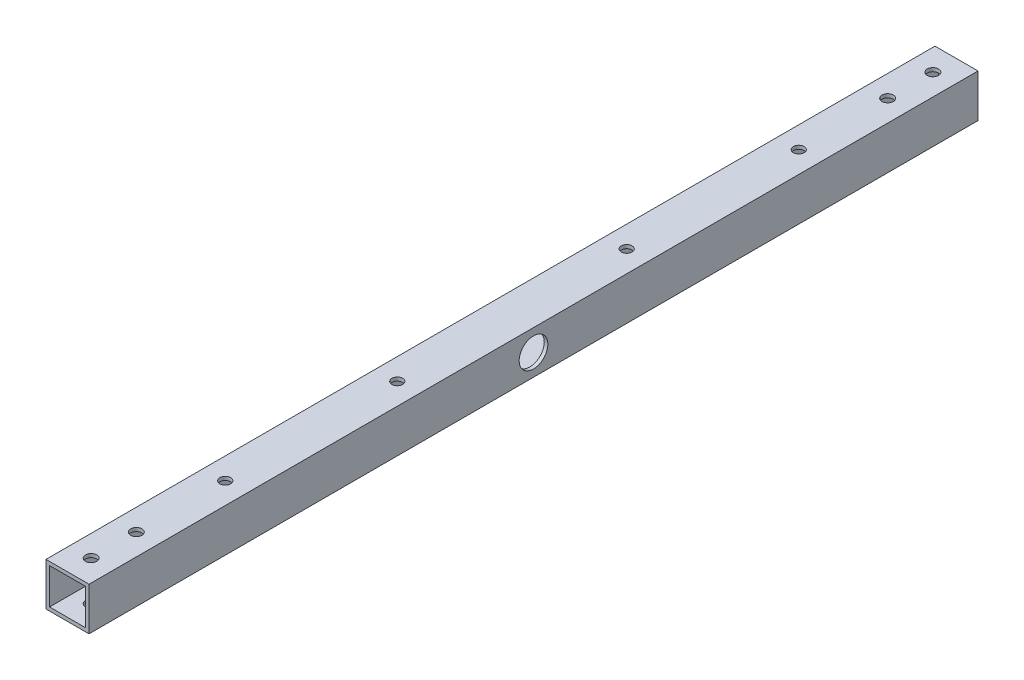
ISO-10303-21;
HEADER;
FILE_DESCRIPTION(('STEP AP214'),'2;1');
FILE_NAME('part.step','',(''),(''),'','','');
FILE_SCHEMA(('AUTOMOTIVE_DESIGN { 1 0 10303 214 1 1 1 1 }'));
ENDSEC;
DATA;
#1=APPLICATION_CONTEXT('core data for automotive mechanical design processes');
#2=APPLICATION_PROTOCOL_DEFINITION('international standard','automotive_design',2000,#1);
#3=PRODUCT_CONTEXT('',#1,'mechanical');
#4=PRODUCT('Part','Part','',(#3));
#5=PRODUCT_RELATED_PRODUCT_CATEGORY('part','',(#4));
#6=PRODUCT_DEFINITION_FORMATION('','',#4);
#7=PRODUCT_DEFINITION_CONTEXT('part definition',#1,'design');
#8=PRODUCT_DEFINITION('design','',#6,#7);
#9=PRODUCT_DEFINITION_SHAPE('','',#8);
#10=(LENGTH_UNIT() NAMED_UNIT(*) SI_UNIT(.MILLI.,.METRE.));
#11=(NAMED_UNIT(*) PLANE_ANGLE_UNIT() SI_UNIT($,.RADIAN.));
#12=(NAMED_UNIT(*) SI_UNIT($,.STERADIAN.) SOLID_ANGLE_UNIT());
#13=UNCERTAINTY_MEASURE_WITH_UNIT(LENGTH_MEASURE(1.E-05),#10,'distance_accuracy_value','');
#14=(GEOMETRIC_REPRESENTATION_CONTEXT(3) GLOBAL_UNCERTAINTY_ASSIGNED_CONTEXT((#13)) GLOBAL_UNIT_ASSIGNED_CONTEXT((#10,
#11,#12)) REPRESENTATION_CONTEXT('',''));
#15=CARTESIAN_POINT('',(0.,0.,0.));
#16=DIRECTION('',(0.,0.,1.));
#17=DIRECTION('',(1.,0.,0.));
#18=AXIS2_PLACEMENT_3D('',#15,#16,#17);
#19=CARTESIAN_POINT('',(0.,0.,196.85));
#20=DIRECTION('',(0.,0.,-1.));
#21=DIRECTION('',(-1.,0.,0.));
#22=AXIS2_PLACEMENT_3D('',#19,#20,#21);
#23=PLANE('',#22);
#24=DIRECTION('',(0.,1.,0.));
#25=VECTOR('',#24,1.);
#26=CARTESIAN_POINT('',(9.525,-9.525,196.85));
#27=LINE('',#26,#25);
#28=CARTESIAN_POINT('',(9.525,-9.525,196.85));
#29=VERTEX_POINT('',#28);
#30=CARTESIAN_POINT('',(9.525,9.525,196.85));
#31=VERTEX_POINT('',#30);
#32=EDGE_CURVE('E137',#29,#31,#27,.T.);
#33=ORIENTED_EDGE('',*,*,#32,.T.);
#34=DIRECTION('',(-1.,0.,0.));
#35=VECTOR('',#34,1.);
#36=CARTESIAN_POINT('',(-9.525,9.525,196.85));
#37=LINE('',#36,#35);
#38=CARTESIAN_POINT('',(-9.525,9.525,196.85));
#39=VERTEX_POINT('',#38);
#40=EDGE_CURVE('E140',#31,#39,#37,.T.);
#41=ORIENTED_EDGE('',*,*,#40,.T.);
#42=DIRECTION('',(0.,-1.,0.));
#43=VECTOR('',#42,1.);
#44=CARTESIAN_POINT('',(-9.525,-9.525,196.85));
#45=LINE('',#44,#43);
#46=CARTESIAN_POINT('',(-9.525,-9.525,196.85));
#47=VERTEX_POINT('',#46);
#48=EDGE_CURVE('E143',#39,#47,#45,.T.);
#49=ORIENTED_EDGE('',*,*,#48,.T.);
#50=DIRECTION('',(1.,0.,0.));
#51=VECTOR('',#50,1.);
#52=CARTESIAN_POINT('',(-9.525,-9.525,196.85));
#53=LINE('',#52,#51);
#54=EDGE_CURVE('E145',#47,#29,#53,.T.);
#55=ORIENTED_EDGE('',*,*,#54,.T.);
#56=EDGE_LOOP('',(#33,#41,#49,#55));
#57=FACE_BOUND('',#56,.T.);
#58=DIRECTION('',(0.,1.,0.));
#59=VECTOR('',#58,1.);
#60=CARTESIAN_POINT('',(7.9375,-7.9375,196.85));
#61=LINE('',#60,#59);
#62=CARTESIAN_POINT('',(7.9375,-7.9375,196.85));
#63=VERTEX_POINT('',#62);
#64=CARTESIAN_POINT('',(7.9375,7.9375,196.85));
#65=VERTEX_POINT('',#64);
#66=EDGE_CURVE('E99',#63,#65,#61,.T.);
#67=ORIENTED_EDGE('',*,*,#66,.F.);
#68=DIRECTION('',(1.,0.,0.));
#69=VECTOR('',#68,1.);
#70=CARTESIAN_POINT('',(-7.9375,-7.9375,196.85));
#71=LINE('',#70,#69);
#72=CARTESIAN_POINT('',(-7.9375,-7.9375,196.85));
#73=VERTEX_POINT('',#72);
#74=EDGE_CURVE('E121',#73,#63,#71,.T.);
#75=ORIENTED_EDGE('',*,*,#74,.F.);
#76=DIRECTION('',(0.,-1.,0.));
#77=VECTOR('',#76,1.);
#78=CARTESIAN_POINT('',(-7.9375,-7.9375,196.85));
#79=LINE('',#78,#77);
#80=CARTESIAN_POINT('',(-7.9375,7.9375,196.85));
#81=VERTEX_POINT('',#80);
#82=EDGE_CURVE('E119',#81,#73,#79,.T.);
#83=ORIENTED_EDGE('',*,*,#82,.F.);
#84=DIRECTION('',(-1.,0.,0.));
#85=VECTOR('',#84,1.);
#86=CARTESIAN_POINT('',(-7.9375,7.9375,196.85));
#87=LINE('',#86,#85);
#88=EDGE_CURVE('E107',#65,#81,#87,.T.);
#89=ORIENTED_EDGE('',*,*,#88,.F.);
#90=EDGE_LOOP('',(#67,#75,#83,#89));
#91=FACE_BOUND('',#90,.T.);
#92=ADVANCED_FACE('F32',(#57,#91),#23,.F.);
#93=CARTESIAN_POINT('',(0.,0.,-196.85));
#94=DIRECTION('',(0.,0.,-1.));
#95=DIRECTION('',(-1.,0.,0.));
#96=AXIS2_PLACEMENT_3D('',#93,#94,#95);
#97=PLANE('',#96);
#98=DIRECTION('',(0.,1.,0.));
#99=VECTOR('',#98,1.);
#100=CARTESIAN_POINT('',(9.525,-9.525,-196.85));
#101=LINE('',#100,#99);
#102=CARTESIAN_POINT('',(9.525,-9.525,-196.85));
#103=VERTEX_POINT('',#102);
#104=CARTESIAN_POINT('',(9.525,9.525,-196.85));
#105=VERTEX_POINT('',#104);
#106=EDGE_CURVE('E115',#103,#105,#101,.T.);
#107=ORIENTED_EDGE('',*,*,#106,.F.);
#108=DIRECTION('',(1.,0.,0.));
#109=VECTOR('',#108,1.);
#110=CARTESIAN_POINT('',(-9.525,-9.525,-196.85));
#111=LINE('',#110,#109);
#112=CARTESIAN_POINT('',(-9.525,-9.525,-196.85));
#113=VERTEX_POINT('',#112);
#114=EDGE_CURVE('E141',#113,#103,#111,.T.);
#115=ORIENTED_EDGE('',*,*,#114,.F.);
#116=DIRECTION('',(0.,-1.,0.));
#117=VECTOR('',#116,1.);
#118=CARTESIAN_POINT('',(-9.525,-9.525,-196.85));
#119=LINE('',#118,#117);
#120=CARTESIAN_POINT('',(-9.525,9.525,-196.85));
#121=VERTEX_POINT('',#120);
#122=EDGE_CURVE('E152',#121,#113,#119,.T.);
#123=ORIENTED_EDGE('',*,*,#122,.F.);
#124=DIRECTION('',(-1.,0.,0.));
#125=VECTOR('',#124,1.);
#126=CARTESIAN_POINT('',(-9.525,9.525,-196.85));
#127=LINE('',#126,#125);
#128=EDGE_CURVE('E150',#105,#121,#127,.T.);
#129=ORIENTED_EDGE('',*,*,#128,.F.);
#130=EDGE_LOOP('',(#107,#115,#123,#129));
#131=FACE_BOUND('',#130,.T.);
#132=DIRECTION('',(1.,0.,0.));
#133=VECTOR('',#132,1.);
#134=CARTESIAN_POINT('',(-7.9375,-7.9375,-196.85));
#135=LINE('',#134,#133);
#136=CARTESIAN_POINT('',(-7.9375,-7.9375,-196.85));
#137=VERTEX_POINT('',#136);
#138=CARTESIAN_POINT('',(7.9375,-7.9375,-196.85));
#139=VERTEX_POINT('',#138);
#140=EDGE_CURVE('E108',#137,#139,#135,.T.);
#141=ORIENTED_EDGE('',*,*,#140,.T.);
#142=DIRECTION('',(0.,1.,0.));
#143=VECTOR('',#142,1.);
#144=CARTESIAN_POINT('',(7.9375,-7.9375,-196.85));
#145=LINE('',#144,#143);
#146=CARTESIAN_POINT('',(7.9375,7.9375,-196.85));
#147=VERTEX_POINT('',#146);
#148=EDGE_CURVE('E57',#139,#147,#145,.T.);
#149=ORIENTED_EDGE('',*,*,#148,.T.);
#150=DIRECTION('',(-1.,0.,0.));
#151=VECTOR('',#150,1.);
#152=CARTESIAN_POINT('',(-7.9375,7.9375,-196.85));
#153=LINE('',#152,#151);
#154=CARTESIAN_POINT('',(-7.9375,7.9375,-196.85));
#155=VERTEX_POINT('',#154);
#156=EDGE_CURVE('E114',#147,#155,#153,.T.);
#157=ORIENTED_EDGE('',*,*,#156,.T.);
#158=DIRECTION('',(0.,-1.,0.));
#159=VECTOR('',#158,1.);
#160=CARTESIAN_POINT('',(-7.9375,-7.9375,-196.85));
#161=LINE('',#160,#159);
#162=EDGE_CURVE('E129',#155,#137,#161,.T.);
#163=ORIENTED_EDGE('',*,*,#162,.T.);
#164=EDGE_LOOP('',(#141,#149,#157,#163));
#165=FACE_BOUND('',#164,.T.);
#166=ADVANCED_FACE('F281',(#131,#165),#97,.T.);
#167=CARTESIAN_POINT('',(9.525,-9.525,196.85));
#168=DIRECTION('',(-1.,0.,0.));
#169=DIRECTION('',(0.,0.,1.));
#170=AXIS2_PLACEMENT_3D('',#167,#168,#169);
#171=PLANE('',#170);
#172=CARTESIAN_POINT('',(9.525,0.,0.));
#173=DIRECTION('',(1.,0.,0.));
#174=DIRECTION('',(0.,0.,-1.));
#175=AXIS2_PLACEMENT_3D('',#172,#173,#174);
#176=CIRCLE('',#175,6.35);
#177=CARTESIAN_POINT('',(9.525,0.,-6.35));
#178=VERTEX_POINT('',#177);
#179=EDGE_CURVE('E254',#178,#178,#176,.T.);
#180=ORIENTED_EDGE('',*,*,#179,.F.);
#181=EDGE_LOOP('',(#180));
#182=FACE_BOUND('',#181,.T.);
#183=ORIENTED_EDGE('',*,*,#106,.T.);
#184=DIRECTION('',(0.,0.,-1.));
#185=VECTOR('',#184,1.);
#186=CARTESIAN_POINT('',(9.525,9.525,196.85));
#187=LINE('',#186,#185);
#188=EDGE_CURVE('E11',#31,#105,#187,.T.);
#189=ORIENTED_EDGE('',*,*,#188,.F.);
#190=ORIENTED_EDGE('',*,*,#32,.F.);
#191=DIRECTION('',(0.,0.,-1.));
#192=VECTOR('',#191,1.);
#193=CARTESIAN_POINT('',(9.525,-9.525,196.85));
#194=LINE('',#193,#192);
#195=EDGE_CURVE('E147',#29,#103,#194,.T.);
#196=ORIENTED_EDGE('',*,*,#195,.T.);
#197=EDGE_LOOP('',(#183,#189,#190,#196));
#198=FACE_BOUND('',#197,.T.);
#199=ADVANCED_FACE('F34',(#182,#198),#171,.F.);
#200=CARTESIAN_POINT('',(-9.525,9.525,196.85));
#201=DIRECTION('',(0.,-1.,0.));
#202=DIRECTION('',(0.,0.,-1.));
#203=AXIS2_PLACEMENT_3D('',#200,#201,#202);
#204=PLANE('',#203);
#205=CARTESIAN_POINT('',(-1.94289029309402E-13,9.525,-50.8));
#206=DIRECTION('',(0.,-1.,0.));
#207=DIRECTION('',(0.,0.,-1.));
#208=AXIS2_PLACEMENT_3D('',#205,#206,#207);
#209=CIRCLE('',#208,2.38125);
#210=CARTESIAN_POINT('',(-1.94289029309402E-13,9.525,-53.18125));
#211=VERTEX_POINT('',#210);
#212=EDGE_CURVE('E180',#211,#211,#209,.T.);
#213=ORIENTED_EDGE('',*,*,#212,.T.);
#214=EDGE_LOOP('',(#213));
#215=FACE_BOUND('',#214,.T.);
#216=CARTESIAN_POINT('',(-1.94289029309402E-13,9.525,50.8));
#217=DIRECTION('',(0.,-1.,0.));
#218=DIRECTION('',(0.,0.,-1.));
#219=AXIS2_PLACEMENT_3D('',#216,#217,#218);
#220=CIRCLE('',#219,2.38124999999998);
#221=CARTESIAN_POINT('',(-1.94289029309402E-13,9.525,48.41875));
#222=VERTEX_POINT('',#221);
#223=EDGE_CURVE('E214',#222,#222,#220,.T.);
#224=ORIENTED_EDGE('',*,*,#223,.T.);
#225=EDGE_LOOP('',(#224));
#226=FACE_BOUND('',#225,.T.);
#227=CARTESIAN_POINT('',(-4.71844785465692E-13,9.525,-127.));
#228=DIRECTION('',(0.,-1.,0.));
#229=DIRECTION('',(0.,0.,-1.));
#230=AXIS2_PLACEMENT_3D('',#227,#228,#229);
#231=CIRCLE('',#230,2.38125);
#232=CARTESIAN_POINT('',(-4.71844785465692E-13,9.525,-129.38125));
#233=VERTEX_POINT('',#232);
#234=EDGE_CURVE('E197',#233,#233,#231,.T.);
#235=ORIENTED_EDGE('',*,*,#234,.T.);
#236=EDGE_LOOP('',(#235));
#237=FACE_BOUND('',#236,.T.);
#238=CARTESIAN_POINT('',(-4.71844785465692E-13,9.525,127.));
#239=DIRECTION('',(0.,-1.,0.));
#240=DIRECTION('',(0.,0.,-1.));
#241=AXIS2_PLACEMENT_3D('',#238,#239,#240);
#242=CIRCLE('',#241,2.38125);
#243=CARTESIAN_POINT('',(-4.71844785465692E-13,9.525,124.61875));
#244=VERTEX_POINT('',#243);
#245=EDGE_CURVE('E193',#244,#244,#242,.T.);
#246=ORIENTED_EDGE('',*,*,#245,.T.);
#247=EDGE_LOOP('',(#246));
#248=FACE_BOUND('',#247,.T.);
#249=CARTESIAN_POINT('',(0.,9.525,-166.375));
#250=DIRECTION('',(0.,-1.,0.));
#251=DIRECTION('',(0.,0.,-1.));
#252=AXIS2_PLACEMENT_3D('',#249,#250,#251);
#253=CIRCLE('',#252,2.5);
#254=CARTESIAN_POINT('',(0.,9.525,-168.875));
#255=VERTEX_POINT('',#254);
#256=EDGE_CURVE('E170',#255,#255,#253,.F.);
#257=ORIENTED_EDGE('',*,*,#256,.F.);
#258=EDGE_LOOP('',(#257));
#259=FACE_BOUND('',#258,.T.);
#260=CARTESIAN_POINT('',(0.,9.525,-186.375));
#261=DIRECTION('',(0.,-1.,0.));
#262=DIRECTION('',(0.,0.,-1.));
#263=AXIS2_PLACEMENT_3D('',#260,#261,#262);
#264=CIRCLE('',#263,2.5);
#265=CARTESIAN_POINT('',(0.,9.525,-188.875));
#266=VERTEX_POINT('',#265);
#267=EDGE_CURVE('E185',#266,#266,#264,.F.);
#268=ORIENTED_EDGE('',*,*,#267,.F.);
#269=EDGE_LOOP('',(#268));
#270=FACE_BOUND('',#269,.T.);
#271=CARTESIAN_POINT('',(0.,9.525,166.375));
#272=DIRECTION('',(0.,-1.,0.));
#273=DIRECTION('',(0.,0.,-1.));
#274=AXIS2_PLACEMENT_3D('',#271,#272,#273);
#275=CIRCLE('',#274,2.5);
#276=CARTESIAN_POINT('',(0.,9.525,163.875));
#277=VERTEX_POINT('',#276);
#278=EDGE_CURVE('E251',#277,#277,#275,.T.);
#279=ORIENTED_EDGE('',*,*,#278,.T.);
#280=EDGE_LOOP('',(#279));
#281=FACE_BOUND('',#280,.T.);
#282=CARTESIAN_POINT('',(0.,9.525,186.375));
#283=DIRECTION('',(0.,-1.,0.));
#284=DIRECTION('',(0.,0.,-1.));
#285=AXIS2_PLACEMENT_3D('',#282,#283,#284);
#286=CIRCLE('',#285,2.5);
#287=CARTESIAN_POINT('',(0.,9.525,183.875));
#288=VERTEX_POINT('',#287);
#289=EDGE_CURVE('E175',#288,#288,#286,.T.);
#290=ORIENTED_EDGE('',*,*,#289,.T.);
#291=EDGE_LOOP('',(#290));
#292=FACE_BOUND('',#291,.T.);
#293=ORIENTED_EDGE('',*,*,#128,.T.);
#294=DIRECTION('',(0.,0.,-1.));
#295=VECTOR('',#294,1.);
#296=CARTESIAN_POINT('',(-9.525,9.525,196.85));
#297=LINE('',#296,#295);
#298=EDGE_CURVE('E41',#39,#121,#297,.T.);
#299=ORIENTED_EDGE('',*,*,#298,.F.);
#300=ORIENTED_EDGE('',*,*,#40,.F.);
#301=ORIENTED_EDGE('',*,*,#188,.T.);
#302=EDGE_LOOP('',(#293,#299,#300,#301));
#303=FACE_BOUND('',#302,.T.);
#304=ADVANCED_FACE('F289',(#215,#226,#237,#248,#259,#270,#281,#292,#303),#204,.F.);
#305=CARTESIAN_POINT('',(-9.525,-9.525,196.85));
#306=DIRECTION('',(1.,0.,0.));
#307=DIRECTION('',(0.,0.,-1.));
#308=AXIS2_PLACEMENT_3D('',#305,#306,#307);
#309=PLANE('',#308);
#310=CARTESIAN_POINT('',(-9.525,0.,0.));
#311=DIRECTION('',(1.,0.,0.));
#312=DIRECTION('',(0.,0.,-1.));
#313=AXIS2_PLACEMENT_3D('',#310,#311,#312);
#314=CIRCLE('',#313,6.35);
#315=CARTESIAN_POINT('',(-9.525,0.,-6.35));
#316=VERTEX_POINT('',#315);
#317=EDGE_CURVE('E165',#316,#316,#314,.T.);
#318=ORIENTED_EDGE('',*,*,#317,.T.);
#319=EDGE_LOOP('',(#318));
#320=FACE_BOUND('',#319,.T.);
#321=ORIENTED_EDGE('',*,*,#122,.T.);
#322=DIRECTION('',(0.,0.,-1.));
#323=VECTOR('',#322,1.);
#324=CARTESIAN_POINT('',(-9.525,-9.525,196.85));
#325=LINE('',#324,#323);
#326=EDGE_CURVE('E157',#47,#113,#325,.T.);
#327=ORIENTED_EDGE('',*,*,#326,.F.);
#328=ORIENTED_EDGE('',*,*,#48,.F.);
#329=ORIENTED_EDGE('',*,*,#298,.T.);
#330=EDGE_LOOP('',(#321,#327,#328,#329));
#331=FACE_BOUND('',#330,.T.);
#332=ADVANCED_FACE('F276',(#320,#331),#309,.F.);
#333=CARTESIAN_POINT('',(-9.525,-9.525,196.85));
#334=DIRECTION('',(0.,1.,0.));
#335=DIRECTION('',(0.,0.,1.));
#336=AXIS2_PLACEMENT_3D('',#333,#334,#335);
#337=PLANE('',#336);
#338=CARTESIAN_POINT('',(-1.94289029309402E-13,-9.525,-50.8));
#339=DIRECTION('',(0.,1.,0.));
#340=DIRECTION('',(0.,0.,1.));
#341=AXIS2_PLACEMENT_3D('',#338,#339,#340);
#342=CIRCLE('',#341,2.38125);
#343=CARTESIAN_POINT('',(-1.94289029309402E-13,-9.525,-48.41875));
#344=VERTEX_POINT('',#343);
#345=EDGE_CURVE('E220',#344,#344,#342,.T.);
#346=ORIENTED_EDGE('',*,*,#345,.T.);
#347=EDGE_LOOP('',(#346));
#348=FACE_BOUND('',#347,.T.);
#349=CARTESIAN_POINT('',(-1.94289029309402E-13,-9.525,50.8));
#350=DIRECTION('',(0.,1.,0.));
#351=DIRECTION('',(0.,0.,1.));
#352=AXIS2_PLACEMENT_3D('',#349,#350,#351);
#353=CIRCLE('',#352,2.38124999999998);
#354=CARTESIAN_POINT('',(-1.94289029309402E-13,-9.525,53.18125));
#355=VERTEX_POINT('',#354);
#356=EDGE_CURVE('E201',#355,#355,#353,.T.);
#357=ORIENTED_EDGE('',*,*,#356,.T.);
#358=EDGE_LOOP('',(#357));
#359=FACE_BOUND('',#358,.T.);
#360=CARTESIAN_POINT('',(-4.71844785465692E-13,-9.525,-127.));
#361=DIRECTION('',(0.,1.,0.));
#362=DIRECTION('',(0.,0.,1.));
#363=AXIS2_PLACEMENT_3D('',#360,#361,#362);
#364=CIRCLE('',#363,2.38125);
#365=CARTESIAN_POINT('',(-4.71844785465692E-13,-9.525,-124.61875));
#366=VERTEX_POINT('',#365);
#367=EDGE_CURVE('E204',#366,#366,#364,.T.);
#368=ORIENTED_EDGE('',*,*,#367,.T.);
#369=EDGE_LOOP('',(#368));
#370=FACE_BOUND('',#369,.T.);
#371=CARTESIAN_POINT('',(-4.71844785465692E-13,-9.525,127.));
#372=DIRECTION('',(0.,1.,0.));
#373=DIRECTION('',(0.,0.,1.));
#374=AXIS2_PLACEMENT_3D('',#371,#372,#373);
#375=CIRCLE('',#374,2.38125);
#376=CARTESIAN_POINT('',(-4.71844785465692E-13,-9.525,129.38125));
#377=VERTEX_POINT('',#376);
#378=EDGE_CURVE('E402',#377,#377,#375,.T.);
#379=ORIENTED_EDGE('',*,*,#378,.T.);
#380=EDGE_LOOP('',(#379));
#381=FACE_BOUND('',#380,.T.);
#382=CARTESIAN_POINT('',(0.,-9.525,-166.375));
#383=DIRECTION('',(0.,1.,0.));
#384=DIRECTION('',(0.,0.,1.));
#385=AXIS2_PLACEMENT_3D('',#382,#383,#384);
#386=CIRCLE('',#385,2.5);
#387=CARTESIAN_POINT('',(0.,-9.525,-163.875));
#388=VERTEX_POINT('',#387);
#389=EDGE_CURVE('E234',#388,#388,#386,.F.);
#390=ORIENTED_EDGE('',*,*,#389,.F.);
#391=EDGE_LOOP('',(#390));
#392=FACE_BOUND('',#391,.T.);
#393=CARTESIAN_POINT('',(0.,-9.525,-186.375));
#394=DIRECTION('',(0.,1.,0.));
#395=DIRECTION('',(0.,0.,1.));
#396=AXIS2_PLACEMENT_3D('',#393,#394,#395);
#397=CIRCLE('',#396,2.5);
#398=CARTESIAN_POINT('',(0.,-9.525,-183.875));
#399=VERTEX_POINT('',#398);
#400=EDGE_CURVE('E227',#399,#399,#397,.F.);
#401=ORIENTED_EDGE('',*,*,#400,.F.);
#402=EDGE_LOOP('',(#401));
#403=FACE_BOUND('',#402,.T.);
#404=CARTESIAN_POINT('',(0.,-9.525,166.375));
#405=DIRECTION('',(0.,1.,0.));
#406=DIRECTION('',(0.,0.,1.));
#407=AXIS2_PLACEMENT_3D('',#404,#405,#406);
#408=CIRCLE('',#407,2.5);
#409=CARTESIAN_POINT('',(0.,-9.525,168.875));
#410=VERTEX_POINT('',#409);
#411=EDGE_CURVE('E248',#410,#410,#408,.T.);
#412=ORIENTED_EDGE('',*,*,#411,.T.);
#413=EDGE_LOOP('',(#412));
#414=FACE_BOUND('',#413,.T.);
#415=CARTESIAN_POINT('',(0.,-9.525,186.375));
#416=DIRECTION('',(0.,1.,0.));
#417=DIRECTION('',(0.,0.,1.));
#418=AXIS2_PLACEMENT_3D('',#415,#416,#417);
#419=CIRCLE('',#418,2.5);
#420=CARTESIAN_POINT('',(0.,-9.525,188.875));
#421=VERTEX_POINT('',#420);
#422=EDGE_CURVE('E241',#421,#421,#419,.T.);
#423=ORIENTED_EDGE('',*,*,#422,.T.);
#424=EDGE_LOOP('',(#423));
#425=FACE_BOUND('',#424,.T.);
#426=ORIENTED_EDGE('',*,*,#114,.T.);
#427=ORIENTED_EDGE('',*,*,#195,.F.);
#428=ORIENTED_EDGE('',*,*,#54,.F.);
#429=ORIENTED_EDGE('',*,*,#326,.T.);
#430=EDGE_LOOP('',(#426,#427,#428,#429));
#431=FACE_BOUND('',#430,.T.);
#432=ADVANCED_FACE('F265',(#348,#359,#370,#381,#392,#403,#414,#425,#431),#337,.F.);
#433=CARTESIAN_POINT('',(7.9375,-7.9375,196.85));
#434=DIRECTION('',(-1.,0.,0.));
#435=DIRECTION('',(0.,-1.,0.));
#436=AXIS2_PLACEMENT_3D('',#433,#434,#435);
#437=PLANE('',#436);
#438=CARTESIAN_POINT('',(7.9375,0.,0.));
#439=DIRECTION('',(-1.,0.,0.));
#440=DIRECTION('',(0.,-1.,0.));
#441=AXIS2_PLACEMENT_3D('',#438,#439,#440);
#442=CIRCLE('',#441,6.35);
#443=CARTESIAN_POINT('',(7.9375,0.,-6.35));
#444=VERTEX_POINT('',#443);
#445=EDGE_CURVE('E127',#444,#444,#442,.T.);
#446=ORIENTED_EDGE('',*,*,#445,.F.);
#447=EDGE_LOOP('',(#446));
#448=FACE_BOUND('',#447,.T.);
#449=ORIENTED_EDGE('',*,*,#148,.F.);
#450=DIRECTION('',(0.,0.,-1.));
#451=VECTOR('',#450,1.);
#452=CARTESIAN_POINT('',(7.9375,-7.9375,196.85));
#453=LINE('',#452,#451);
#454=EDGE_CURVE('E103',#63,#139,#453,.T.);
#455=ORIENTED_EDGE('',*,*,#454,.F.);
#456=ORIENTED_EDGE('',*,*,#66,.T.);
#457=DIRECTION('',(0.,0.,-1.));
#458=VECTOR('',#457,1.);
#459=CARTESIAN_POINT('',(7.9375,7.9375,196.85));
#460=LINE('',#459,#458);
#461=EDGE_CURVE('E102',#65,#147,#460,.T.);
#462=ORIENTED_EDGE('',*,*,#461,.T.);
#463=EDGE_LOOP('',(#449,#455,#456,#462));
#464=FACE_BOUND('',#463,.T.);
#465=ADVANCED_FACE('F101',(#448,#464),#437,.T.);
#466=CARTESIAN_POINT('',(-7.9375,7.9375,196.85));
#467=DIRECTION('',(0.,-1.,0.));
#468=DIRECTION('',(0.,0.,-1.));
#469=AXIS2_PLACEMENT_3D('',#466,#467,#468);
#470=PLANE('',#469);
#471=CARTESIAN_POINT('',(-1.94289029309402E-13,7.9375,-50.8));
#472=DIRECTION('',(0.,-1.,0.));
#473=DIRECTION('',(0.,0.,-1.));
#474=AXIS2_PLACEMENT_3D('',#471,#472,#473);
#475=CIRCLE('',#474,2.38125);
#476=CARTESIAN_POINT('',(-1.94289029309402E-13,7.9375,-53.18125));
#477=VERTEX_POINT('',#476);
#478=EDGE_CURVE('E217',#477,#477,#475,.T.);
#479=ORIENTED_EDGE('',*,*,#478,.F.);
#480=EDGE_LOOP('',(#479));
#481=FACE_BOUND('',#480,.T.);
#482=CARTESIAN_POINT('',(-1.94289029309402E-13,7.9375,50.8));
#483=DIRECTION('',(0.,-1.,0.));
#484=DIRECTION('',(0.,0.,-1.));
#485=AXIS2_PLACEMENT_3D('',#482,#483,#484);
#486=CIRCLE('',#485,2.38124999999998);
#487=CARTESIAN_POINT('',(-1.94289029309402E-13,7.9375,48.41875));
#488=VERTEX_POINT('',#487);
#489=EDGE_CURVE('E196',#488,#488,#486,.T.);
#490=ORIENTED_EDGE('',*,*,#489,.F.);
#491=EDGE_LOOP('',(#490));
#492=FACE_BOUND('',#491,.T.);
#493=CARTESIAN_POINT('',(-4.71844785465692E-13,7.9375,-127.));
#494=DIRECTION('',(0.,-1.,0.));
#495=DIRECTION('',(0.,0.,-1.));
#496=AXIS2_PLACEMENT_3D('',#493,#494,#495);
#497=CIRCLE('',#496,2.38125);
#498=CARTESIAN_POINT('',(-4.71844785465692E-13,7.9375,-129.38125));
#499=VERTEX_POINT('',#498);
#500=EDGE_CURVE('E192',#499,#499,#497,.T.);
#501=ORIENTED_EDGE('',*,*,#500,.F.);
#502=EDGE_LOOP('',(#501));
#503=FACE_BOUND('',#502,.T.);
#504=CARTESIAN_POINT('',(-4.71844785465692E-13,7.9375,127.));
#505=DIRECTION('',(0.,-1.,0.));
#506=DIRECTION('',(0.,0.,-1.));
#507=AXIS2_PLACEMENT_3D('',#504,#505,#506);
#508=CIRCLE('',#507,2.38125);
#509=CARTESIAN_POINT('',(-4.71844785465692E-13,7.9375,124.61875));
#510=VERTEX_POINT('',#509);
#511=EDGE_CURVE('E189',#510,#510,#508,.T.);
#512=ORIENTED_EDGE('',*,*,#511,.F.);
#513=EDGE_LOOP('',(#512));
#514=FACE_BOUND('',#513,.T.);
#515=CARTESIAN_POINT('',(0.,7.9375,-166.375));
#516=DIRECTION('',(0.,-1.,0.));
#517=DIRECTION('',(0.,0.,-1.));
#518=AXIS2_PLACEMENT_3D('',#515,#516,#517);
#519=CIRCLE('',#518,2.5);
#520=CARTESIAN_POINT('',(0.,7.9375,-168.875));
#521=VERTEX_POINT('',#520);
#522=EDGE_CURVE('E184',#521,#521,#519,.F.);
#523=ORIENTED_EDGE('',*,*,#522,.T.);
#524=EDGE_LOOP('',(#523));
#525=FACE_BOUND('',#524,.T.);
#526=CARTESIAN_POINT('',(0.,7.9375,-186.375));
#527=DIRECTION('',(0.,-1.,0.));
#528=DIRECTION('',(0.,0.,-1.));
#529=AXIS2_PLACEMENT_3D('',#526,#527,#528);
#530=CIRCLE('',#529,2.5);
#531=CARTESIAN_POINT('',(0.,7.9375,-188.875));
#532=VERTEX_POINT('',#531);
#533=EDGE_CURVE('E179',#532,#532,#530,.F.);
#534=ORIENTED_EDGE('',*,*,#533,.T.);
#535=EDGE_LOOP('',(#534));
#536=FACE_BOUND('',#535,.T.);
#537=CARTESIAN_POINT('',(0.,7.9375,166.375));
#538=DIRECTION('',(0.,-1.,0.));
#539=DIRECTION('',(0.,0.,-1.));
#540=AXIS2_PLACEMENT_3D('',#537,#538,#539);
#541=CIRCLE('',#540,2.5);
#542=CARTESIAN_POINT('',(0.,7.9375,163.875));
#543=VERTEX_POINT('',#542);
#544=EDGE_CURVE('E174',#543,#543,#541,.T.);
#545=ORIENTED_EDGE('',*,*,#544,.F.);
#546=EDGE_LOOP('',(#545));
#547=FACE_BOUND('',#546,.T.);
#548=CARTESIAN_POINT('',(0.,7.9375,186.375));
#549=DIRECTION('',(0.,-1.,0.));
#550=DIRECTION('',(0.,0.,-1.));
#551=AXIS2_PLACEMENT_3D('',#548,#549,#550);
#552=CIRCLE('',#551,2.5);
#553=CARTESIAN_POINT('',(0.,7.9375,183.875));
#554=VERTEX_POINT('',#553);
#555=EDGE_CURVE('E169',#554,#554,#552,.T.);
#556=ORIENTED_EDGE('',*,*,#555,.F.);
#557=EDGE_LOOP('',(#556));
#558=FACE_BOUND('',#557,.T.);
#559=ORIENTED_EDGE('',*,*,#156,.F.);
#560=ORIENTED_EDGE('',*,*,#461,.F.);
#561=ORIENTED_EDGE('',*,*,#88,.T.);
#562=DIRECTION('',(0.,0.,-1.));
#563=VECTOR('',#562,1.);
#564=CARTESIAN_POINT('',(-7.9375,7.9375,196.85));
#565=LINE('',#564,#563);
#566=EDGE_CURVE('E116',#81,#155,#565,.T.);
#567=ORIENTED_EDGE('',*,*,#566,.T.);
#568=EDGE_LOOP('',(#559,#560,#561,#567));
#569=FACE_BOUND('',#568,.T.);
#570=ADVANCED_FACE('F111',(#481,#492,#503,#514,#525,#536,#547,#558,#569),#470,.T.);
#571=CARTESIAN_POINT('',(-7.9375,-7.9375,196.85));
#572=DIRECTION('',(1.,0.,0.));
#573=DIRECTION('',(0.,0.,-1.));
#574=AXIS2_PLACEMENT_3D('',#571,#572,#573);
#575=PLANE('',#574);
#576=CARTESIAN_POINT('',(-7.9375,0.,0.));
#577=DIRECTION('',(1.,0.,0.));
#578=DIRECTION('',(0.,0.,-1.));
#579=AXIS2_PLACEMENT_3D('',#576,#577,#578);
#580=CIRCLE('',#579,6.35);
#581=CARTESIAN_POINT('',(-7.9375,0.,-6.35));
#582=VERTEX_POINT('',#581);
#583=EDGE_CURVE('E162',#582,#582,#580,.T.);
#584=ORIENTED_EDGE('',*,*,#583,.F.);
#585=EDGE_LOOP('',(#584));
#586=FACE_BOUND('',#585,.T.);
#587=ORIENTED_EDGE('',*,*,#162,.F.);
#588=ORIENTED_EDGE('',*,*,#566,.F.);
#589=ORIENTED_EDGE('',*,*,#82,.T.);
#590=DIRECTION('',(0.,0.,-1.));
#591=VECTOR('',#590,1.);
#592=CARTESIAN_POINT('',(-7.9375,-7.9375,196.85));
#593=LINE('',#592,#591);
#594=EDGE_CURVE('E49',#73,#137,#593,.T.);
#595=ORIENTED_EDGE('',*,*,#594,.T.);
#596=EDGE_LOOP('',(#587,#588,#589,#595));
#597=FACE_BOUND('',#596,.T.);
#598=ADVANCED_FACE('F272',(#586,#597),#575,.T.);
#599=CARTESIAN_POINT('',(-7.9375,-7.9375,196.85));
#600=DIRECTION('',(0.,1.,0.));
#601=DIRECTION('',(0.,0.,1.));
#602=AXIS2_PLACEMENT_3D('',#599,#600,#601);
#603=PLANE('',#602);
#604=CARTESIAN_POINT('',(-1.94289029309402E-13,-7.9375,-50.8));
#605=DIRECTION('',(0.,1.,0.));
#606=DIRECTION('',(0.,0.,1.));
#607=AXIS2_PLACEMENT_3D('',#604,#605,#606);
#608=CIRCLE('',#607,2.38125);
#609=CARTESIAN_POINT('',(-1.94289029309402E-13,-7.9375,-48.41875));
#610=VERTEX_POINT('',#609);
#611=EDGE_CURVE('E36',#610,#610,#608,.T.);
#612=ORIENTED_EDGE('',*,*,#611,.F.);
#613=EDGE_LOOP('',(#612));
#614=FACE_BOUND('',#613,.T.);
#615=CARTESIAN_POINT('',(-1.94289029309402E-13,-7.9375,50.8));
#616=DIRECTION('',(0.,1.,0.));
#617=DIRECTION('',(0.,0.,1.));
#618=AXIS2_PLACEMENT_3D('',#615,#616,#617);
#619=CIRCLE('',#618,2.38124999999998);
#620=CARTESIAN_POINT('',(-1.94289029309402E-13,-7.9375,53.18125));
#621=VERTEX_POINT('',#620);
#622=EDGE_CURVE('E194',#621,#621,#619,.T.);
#623=ORIENTED_EDGE('',*,*,#622,.F.);
#624=EDGE_LOOP('',(#623));
#625=FACE_BOUND('',#624,.T.);
#626=CARTESIAN_POINT('',(-4.71844785465692E-13,-7.9375,-127.));
#627=DIRECTION('',(0.,1.,0.));
#628=DIRECTION('',(0.,0.,1.));
#629=AXIS2_PLACEMENT_3D('',#626,#627,#628);
#630=CIRCLE('',#629,2.38125);
#631=CARTESIAN_POINT('',(-4.71844785465692E-13,-7.9375,-124.61875));
#632=VERTEX_POINT('',#631);
#633=EDGE_CURVE('E190',#632,#632,#630,.T.);
#634=ORIENTED_EDGE('',*,*,#633,.F.);
#635=EDGE_LOOP('',(#634));
#636=FACE_BOUND('',#635,.T.);
#637=CARTESIAN_POINT('',(-4.71844785465692E-13,-7.9375,127.));
#638=DIRECTION('',(0.,1.,0.));
#639=DIRECTION('',(0.,0.,1.));
#640=AXIS2_PLACEMENT_3D('',#637,#638,#639);
#641=CIRCLE('',#640,2.38125);
#642=CARTESIAN_POINT('',(-4.71844785465692E-13,-7.9375,129.38125));
#643=VERTEX_POINT('',#642);
#644=EDGE_CURVE('E186',#643,#643,#641,.T.);
#645=ORIENTED_EDGE('',*,*,#644,.F.);
#646=EDGE_LOOP('',(#645));
#647=FACE_BOUND('',#646,.T.);
#648=CARTESIAN_POINT('',(0.,-7.9375,-166.375));
#649=DIRECTION('',(0.,1.,0.));
#650=DIRECTION('',(0.,0.,1.));
#651=AXIS2_PLACEMENT_3D('',#648,#649,#650);
#652=CIRCLE('',#651,2.5);
#653=CARTESIAN_POINT('',(0.,-7.9375,-163.875));
#654=VERTEX_POINT('',#653);
#655=EDGE_CURVE('E181',#654,#654,#652,.F.);
#656=ORIENTED_EDGE('',*,*,#655,.T.);
#657=EDGE_LOOP('',(#656));
#658=FACE_BOUND('',#657,.T.);
#659=CARTESIAN_POINT('',(0.,-7.9375,-186.375));
#660=DIRECTION('',(0.,1.,0.));
#661=DIRECTION('',(0.,0.,1.));
#662=AXIS2_PLACEMENT_3D('',#659,#660,#661);
#663=CIRCLE('',#662,2.5);
#664=CARTESIAN_POINT('',(0.,-7.9375,-183.875));
#665=VERTEX_POINT('',#664);
#666=EDGE_CURVE('E176',#665,#665,#663,.F.);
#667=ORIENTED_EDGE('',*,*,#666,.T.);
#668=EDGE_LOOP('',(#667));
#669=FACE_BOUND('',#668,.T.);
#670=CARTESIAN_POINT('',(0.,-7.9375,166.375));
#671=DIRECTION('',(0.,1.,0.));
#672=DIRECTION('',(0.,0.,1.));
#673=AXIS2_PLACEMENT_3D('',#670,#671,#672);
#674=CIRCLE('',#673,2.5);
#675=CARTESIAN_POINT('',(0.,-7.9375,168.875));
#676=VERTEX_POINT('',#675);
#677=EDGE_CURVE('E171',#676,#676,#674,.T.);
#678=ORIENTED_EDGE('',*,*,#677,.F.);
#679=EDGE_LOOP('',(#678));
#680=FACE_BOUND('',#679,.T.);
#681=CARTESIAN_POINT('',(0.,-7.9375,186.375));
#682=DIRECTION('',(0.,1.,0.));
#683=DIRECTION('',(0.,0.,1.));
#684=AXIS2_PLACEMENT_3D('',#681,#682,#683);
#685=CIRCLE('',#684,2.5);
#686=CARTESIAN_POINT('',(0.,-7.9375,188.875));
#687=VERTEX_POINT('',#686);
#688=EDGE_CURVE('E166',#687,#687,#685,.T.);
#689=ORIENTED_EDGE('',*,*,#688,.F.);
#690=EDGE_LOOP('',(#689));
#691=FACE_BOUND('',#690,.T.);
#692=ORIENTED_EDGE('',*,*,#140,.F.);
#693=ORIENTED_EDGE('',*,*,#594,.F.);
#694=ORIENTED_EDGE('',*,*,#74,.T.);
#695=ORIENTED_EDGE('',*,*,#454,.T.);
#696=EDGE_LOOP('',(#692,#693,#694,#695));
#697=FACE_BOUND('',#696,.T.);
#698=ADVANCED_FACE('F328',(#614,#625,#636,#647,#658,#669,#680,#691,#697),#603,.T.);
#699=CARTESIAN_POINT('',(-9.525,0.,0.));
#700=DIRECTION('',(1.,0.,0.));
#701=DIRECTION('',(0.,0.,-1.));
#702=AXIS2_PLACEMENT_3D('',#699,#700,#701);
#703=CYLINDRICAL_SURFACE('',#702,6.35);
#704=CARTESIAN_POINT('',(-7.9375,0.,-6.35));
#705=CARTESIAN_POINT('',(-7.95403645833333,0.,-6.35));
#706=CARTESIAN_POINT('',(-7.97057291666667,0.,-6.35));
#707=CARTESIAN_POINT('',(-8.00364583333334,0.,-6.35));
#708=CARTESIAN_POINT('',(-8.02018229166667,0.,-6.35));
#709=CARTESIAN_POINT('',(-8.05325520833333,0.,-6.35));
#710=CARTESIAN_POINT('',(-8.06979166666667,0.,-6.35));
#711=CARTESIAN_POINT('',(-8.10286458333333,0.,-6.35));
#712=CARTESIAN_POINT('',(-8.11940104166667,0.,-6.35));
#713=CARTESIAN_POINT('',(-8.15247395833333,0.,-6.35));
#714=CARTESIAN_POINT('',(-8.16901041666667,0.,-6.35));
#715=CARTESIAN_POINT('',(-8.20208333333334,0.,-6.35));
#716=CARTESIAN_POINT('',(-8.21861979166667,0.,-6.35));
#717=CARTESIAN_POINT('',(-8.25169270833333,0.,-6.35));
#718=CARTESIAN_POINT('',(-8.26822916666667,0.,-6.35));
#719=CARTESIAN_POINT('',(-8.30130208333333,0.,-6.35));
#720=CARTESIAN_POINT('',(-8.31783854166667,0.,-6.35));
#721=CARTESIAN_POINT('',(-8.35091145833333,0.,-6.35));
#722=CARTESIAN_POINT('',(-8.36744791666667,0.,-6.35));
#723=CARTESIAN_POINT('',(-8.40052083333333,0.,-6.35));
#724=CARTESIAN_POINT('',(-8.41705729166667,0.,-6.35));
#725=CARTESIAN_POINT('',(-8.45013020833333,0.,-6.35));
#726=CARTESIAN_POINT('',(-8.46666666666667,0.,-6.35));
#727=CARTESIAN_POINT('',(-8.49973958333333,0.,-6.35));
#728=CARTESIAN_POINT('',(-8.51627604166667,0.,-6.35));
#729=CARTESIAN_POINT('',(-8.54934895833333,0.,-6.35));
#730=CARTESIAN_POINT('',(-8.56588541666667,0.,-6.35));
#731=CARTESIAN_POINT('',(-8.59895833333334,0.,-6.35));
#732=CARTESIAN_POINT('',(-8.61549479166667,0.,-6.35));
#733=CARTESIAN_POINT('',(-8.64856770833333,0.,-6.35));
#734=CARTESIAN_POINT('',(-8.66510416666667,0.,-6.35));
#735=CARTESIAN_POINT('',(-8.69817708333333,0.,-6.35));
#736=CARTESIAN_POINT('',(-8.71471354166667,0.,-6.35));
#737=CARTESIAN_POINT('',(-8.74778645833334,0.,-6.35));
#738=CARTESIAN_POINT('',(-8.76432291666667,0.,-6.35));
#739=CARTESIAN_POINT('',(-8.79739583333333,0.,-6.35));
#740=CARTESIAN_POINT('',(-8.81393229166667,0.,-6.35));
#741=CARTESIAN_POINT('',(-8.84700520833333,0.,-6.35));
#742=CARTESIAN_POINT('',(-8.86354166666667,0.,-6.35));
#743=CARTESIAN_POINT('',(-8.89661458333333,0.,-6.35));
#744=CARTESIAN_POINT('',(-8.91315104166667,0.,-6.35));
#745=CARTESIAN_POINT('',(-8.94622395833333,0.,-6.35));
#746=CARTESIAN_POINT('',(-8.96276041666667,0.,-6.35));
#747=CARTESIAN_POINT('',(-8.99583333333334,0.,-6.35));
#748=CARTESIAN_POINT('',(-9.01236979166667,0.,-6.35));
#749=CARTESIAN_POINT('',(-9.04544270833333,0.,-6.35));
#750=CARTESIAN_POINT('',(-9.06197916666667,0.,-6.35));
#751=CARTESIAN_POINT('',(-9.09505208333333,0.,-6.35));
#752=CARTESIAN_POINT('',(-9.11158854166667,0.,-6.35));
#753=CARTESIAN_POINT('',(-9.14466145833333,0.,-6.35));
#754=CARTESIAN_POINT('',(-9.16119791666667,0.,-6.35));
#755=CARTESIAN_POINT('',(-9.19427083333334,0.,-6.35));
#756=CARTESIAN_POINT('',(-9.21080729166667,0.,-6.35));
#757=CARTESIAN_POINT('',(-9.24388020833333,0.,-6.35));
#758=CARTESIAN_POINT('',(-9.26041666666667,0.,-6.35));
#759=CARTESIAN_POINT('',(-9.29348958333333,0.,-6.35));
#760=CARTESIAN_POINT('',(-9.31002604166667,0.,-6.35));
#761=CARTESIAN_POINT('',(-9.34309895833334,0.,-6.35));
#762=CARTESIAN_POINT('',(-9.35963541666667,0.,-6.35));
#763=CARTESIAN_POINT('',(-9.39270833333333,0.,-6.35));
#764=CARTESIAN_POINT('',(-9.40924479166667,0.,-6.35));
#765=CARTESIAN_POINT('',(-9.44231770833333,0.,-6.35));
#766=CARTESIAN_POINT('',(-9.45885416666667,0.,-6.35));
#767=CARTESIAN_POINT('',(-9.49192708333333,0.,-6.35));
#768=CARTESIAN_POINT('',(-9.50846354166667,0.,-6.35));
#769=CARTESIAN_POINT('',(-9.525,0.,-6.35));
#770=B_SPLINE_CURVE_WITH_KNOTS('',3,(#704,#705,#706,#707,#708,#709,#710,#711,#712,#713,#714,
#715,#716,#717,#718,#719,#720,#721,#722,#723,#724,#725,#726,#727,#728,#729,#730,#731,#732,#733,
#734,#735,#736,#737,#738,#739,#740,#741,#742,#743,#744,#745,#746,#747,#748,#749,#750,#751,#752,
#753,#754,#755,#756,#757,#758,#759,#760,#761,#762,#763,#764,#765,#766,#767,#768,#769),
.UNSPECIFIED.,.F.,.F.,(4,2,2,2,2,2,2,2,2,2,2,2,2,2,2,2,2,2,2,2,2,2,2,2,2,2,2,2,2,2,2,2,4),(0.,
0.0496093749999989,0.0992187499999995,0.148828125,0.198437499999999,0.248046875,0.29765625,
0.347265624999999,0.396875,0.446484374999999,0.496093749999999,0.545703125,0.595312499999999,
0.644921874999999,0.69453125,0.744140624999999,0.793749999999999,0.843359375,0.892968749999999,
0.942578124999999,0.9921875,1.041796875,1.09140625,1.141015625,1.190625,1.240234375,1.28984375,
1.339453125,1.3890625,1.438671875,1.48828125,1.537890625,1.5875),.UNSPECIFIED.);
#771=EDGE_CURVE('BSEAM330',#582,#316,#770,.T.);
#772=ORIENTED_EDGE('',*,*,#583,.T.);
#773=ORIENTED_EDGE('',*,*,#317,.F.);
#774=ORIENTED_EDGE('',*,*,#771,.T.);
#775=ORIENTED_EDGE('',*,*,#771,.F.);
#776=EDGE_LOOP('',(#772,#774,#773,#775));
#777=FACE_BOUND('',#776,.T.);
#778=ADVANCED_FACE('F330',(#777),#703,.F.);
#779=CARTESIAN_POINT('',(7.9375,0.,-6.35));
#780=CARTESIAN_POINT('',(7.95403645833333,0.,-6.35));
#781=CARTESIAN_POINT('',(7.97057291666667,0.,-6.35));
#782=CARTESIAN_POINT('',(8.00364583333334,0.,-6.35));
#783=CARTESIAN_POINT('',(8.02018229166667,0.,-6.35));
#784=CARTESIAN_POINT('',(8.05325520833333,0.,-6.35));
#785=CARTESIAN_POINT('',(8.06979166666667,0.,-6.35));
#786=CARTESIAN_POINT('',(8.10286458333333,0.,-6.35));
#787=CARTESIAN_POINT('',(8.11940104166667,0.,-6.35));
#788=CARTESIAN_POINT('',(8.15247395833333,0.,-6.35));
#789=CARTESIAN_POINT('',(8.16901041666667,0.,-6.35));
#790=CARTESIAN_POINT('',(8.20208333333334,0.,-6.35));
#791=CARTESIAN_POINT('',(8.21861979166667,0.,-6.35));
#792=CARTESIAN_POINT('',(8.25169270833333,0.,-6.35));
#793=CARTESIAN_POINT('',(8.26822916666667,0.,-6.35));
#794=CARTESIAN_POINT('',(8.30130208333333,0.,-6.35));
#795=CARTESIAN_POINT('',(8.31783854166667,0.,-6.35));
#796=CARTESIAN_POINT('',(8.35091145833333,0.,-6.35));
#797=CARTESIAN_POINT('',(8.36744791666667,0.,-6.35));
#798=CARTESIAN_POINT('',(8.40052083333333,0.,-6.35));
#799=CARTESIAN_POINT('',(8.41705729166667,0.,-6.35));
#800=CARTESIAN_POINT('',(8.45013020833333,0.,-6.35));
#801=CARTESIAN_POINT('',(8.46666666666667,0.,-6.35));
#802=CARTESIAN_POINT('',(8.49973958333333,0.,-6.35));
#803=CARTESIAN_POINT('',(8.51627604166667,0.,-6.35));
#804=CARTESIAN_POINT('',(8.54934895833333,0.,-6.35));
#805=CARTESIAN_POINT('',(8.56588541666667,0.,-6.35));
#806=CARTESIAN_POINT('',(8.59895833333333,0.,-6.35));
#807=CARTESIAN_POINT('',(8.61549479166667,0.,-6.35));
#808=CARTESIAN_POINT('',(8.64856770833333,0.,-6.35));
#809=CARTESIAN_POINT('',(8.66510416666667,0.,-6.35));
#810=CARTESIAN_POINT('',(8.69817708333333,0.,-6.35));
#811=CARTESIAN_POINT('',(8.71471354166667,0.,-6.35));
#812=CARTESIAN_POINT('',(8.74778645833333,0.,-6.35));
#813=CARTESIAN_POINT('',(8.76432291666667,0.,-6.35));
#814=CARTESIAN_POINT('',(8.79739583333333,0.,-6.35));
#815=CARTESIAN_POINT('',(8.81393229166667,0.,-6.35));
#816=CARTESIAN_POINT('',(8.84700520833333,0.,-6.35));
#817=CARTESIAN_POINT('',(8.86354166666667,0.,-6.35));
#818=CARTESIAN_POINT('',(8.89661458333333,0.,-6.35));
#819=CARTESIAN_POINT('',(8.91315104166667,0.,-6.35));
#820=CARTESIAN_POINT('',(8.94622395833333,0.,-6.35));
#821=CARTESIAN_POINT('',(8.96276041666667,0.,-6.35));
#822=CARTESIAN_POINT('',(8.99583333333334,0.,-6.35));
#823=CARTESIAN_POINT('',(9.01236979166667,0.,-6.35));
#824=CARTESIAN_POINT('',(9.04544270833333,0.,-6.35));
#825=CARTESIAN_POINT('',(9.06197916666667,0.,-6.35));
#826=CARTESIAN_POINT('',(9.09505208333333,0.,-6.35));
#827=CARTESIAN_POINT('',(9.11158854166667,0.,-6.35));
#828=CARTESIAN_POINT('',(9.14466145833333,0.,-6.35));
#829=CARTESIAN_POINT('',(9.16119791666667,0.,-6.35));
#830=CARTESIAN_POINT('',(9.19427083333333,0.,-6.35));
#831=CARTESIAN_POINT('',(9.21080729166667,0.,-6.35));
#832=CARTESIAN_POINT('',(9.24388020833333,0.,-6.35));
#833=CARTESIAN_POINT('',(9.26041666666667,0.,-6.35));
#834=CARTESIAN_POINT('',(9.29348958333333,0.,-6.35));
#835=CARTESIAN_POINT('',(9.31002604166667,0.,-6.35));
#836=CARTESIAN_POINT('',(9.34309895833333,0.,-6.35));
#837=CARTESIAN_POINT('',(9.35963541666667,0.,-6.35));
#838=CARTESIAN_POINT('',(9.39270833333333,0.,-6.35));
#839=CARTESIAN_POINT('',(9.40924479166667,0.,-6.35));
#840=CARTESIAN_POINT('',(9.44231770833333,0.,-6.35));
#841=CARTESIAN_POINT('',(9.45885416666667,0.,-6.35));
#842=CARTESIAN_POINT('',(9.49192708333333,0.,-6.35));
#843=CARTESIAN_POINT('',(9.50846354166667,0.,-6.35));
#844=CARTESIAN_POINT('',(9.525,0.,-6.35));
#845=B_SPLINE_CURVE_WITH_KNOTS('',3,(#779,#780,#781,#782,#783,#784,#785,#786,#787,#788,#789,
#790,#791,#792,#793,#794,#795,#796,#797,#798,#799,#800,#801,#802,#803,#804,#805,#806,#807,#808,
#809,#810,#811,#812,#813,#814,#815,#816,#817,#818,#819,#820,#821,#822,#823,#824,#825,#826,#827,
#828,#829,#830,#831,#832,#833,#834,#835,#836,#837,#838,#839,#840,#841,#842,#843,#844),
.UNSPECIFIED.,.F.,.F.,(4,2,2,2,2,2,2,2,2,2,2,2,2,2,2,2,2,2,2,2,2,2,2,2,2,2,2,2,2,2,2,2,4),(0.,
0.0496093749999989,0.0992187500000012,0.148828125,0.198437499999999,0.248046875000001,
0.29765625,0.347265624999999,0.396874999999998,0.446484375,0.496093749999999,0.545703124999998,
0.5953125,0.644921874999999,0.694531249999998,0.744140625,0.793749999999999,0.843359374999998,
0.892968750000001,0.942578124999999,0.992187499999998,1.041796875,1.09140625,1.141015625,
1.190625,1.240234375,1.28984375,1.339453125,1.3890625,1.438671875,1.48828125,1.537890625,
1.5875),.UNSPECIFIED.);
#846=EDGE_CURVE('BSEAM261',#444,#178,#845,.T.);
#847=ORIENTED_EDGE('',*,*,#445,.T.);
#848=ORIENTED_EDGE('',*,*,#179,.T.);
#849=ORIENTED_EDGE('',*,*,#846,.T.);
#850=ORIENTED_EDGE('',*,*,#846,.F.);
#851=EDGE_LOOP('',(#847,#849,#848,#850));
#852=FACE_BOUND('',#851,.T.);
#853=ADVANCED_FACE('F261',(#852),#703,.F.);
#854=CARTESIAN_POINT('',(0.,-16.475,186.375));
#855=DIRECTION('',(0.,1.,0.));
#856=DIRECTION('',(0.,0.,1.));
#857=AXIS2_PLACEMENT_3D('',#854,#855,#856);
#858=CYLINDRICAL_SURFACE('',#857,2.5);
#859=ORIENTED_EDGE('',*,*,#688,.T.);
#860=EDGE_LOOP('',(#859));
#861=FACE_BOUND('',#860,.T.);
#862=ORIENTED_EDGE('',*,*,#422,.F.);
#863=EDGE_LOOP('',(#862));
#864=FACE_BOUND('',#863,.T.);
#865=ADVANCED_FACE('F354',(#861,#864),#858,.F.);
#866=CARTESIAN_POINT('',(0.,-16.475,166.375));
#867=DIRECTION('',(0.,1.,0.));
#868=DIRECTION('',(0.,0.,1.));
#869=AXIS2_PLACEMENT_3D('',#866,#867,#868);
#870=CYLINDRICAL_SURFACE('',#869,2.5);
#871=ORIENTED_EDGE('',*,*,#677,.T.);
#872=EDGE_LOOP('',(#871));
#873=FACE_BOUND('',#872,.T.);
#874=ORIENTED_EDGE('',*,*,#411,.F.);
#875=EDGE_LOOP('',(#874));
#876=FACE_BOUND('',#875,.T.);
#877=ADVANCED_FACE('F350',(#873,#876),#870,.F.);
#878=ORIENTED_EDGE('',*,*,#555,.T.);
#879=EDGE_LOOP('',(#878));
#880=FACE_BOUND('',#879,.T.);
#881=ORIENTED_EDGE('',*,*,#289,.F.);
#882=EDGE_LOOP('',(#881));
#883=FACE_BOUND('',#882,.T.);
#884=ADVANCED_FACE('F348',(#880,#883),#858,.F.);
#885=ORIENTED_EDGE('',*,*,#544,.T.);
#886=EDGE_LOOP('',(#885));
#887=FACE_BOUND('',#886,.T.);
#888=ORIENTED_EDGE('',*,*,#278,.F.);
#889=EDGE_LOOP('',(#888));
#890=FACE_BOUND('',#889,.T.);
#891=ADVANCED_FACE('F344',(#887,#890),#870,.F.);
#892=CARTESIAN_POINT('',(0.,-16.475,-186.375));
#893=DIRECTION('',(0.,1.,0.));
#894=DIRECTION('',(0.,0.,1.));
#895=AXIS2_PLACEMENT_3D('',#892,#893,#894);
#896=CYLINDRICAL_SURFACE('',#895,2.5);
#897=ORIENTED_EDGE('',*,*,#666,.F.);
#898=EDGE_LOOP('',(#897));
#899=FACE_BOUND('',#898,.T.);
#900=ORIENTED_EDGE('',*,*,#400,.T.);
#901=EDGE_LOOP('',(#900));
#902=FACE_BOUND('',#901,.T.);
#903=ADVANCED_FACE('F347',(#899,#902),#896,.F.);
#904=CARTESIAN_POINT('',(0.,-16.475,-166.375));
#905=DIRECTION('',(0.,1.,0.));
#906=DIRECTION('',(0.,0.,1.));
#907=AXIS2_PLACEMENT_3D('',#904,#905,#906);
#908=CYLINDRICAL_SURFACE('',#907,2.5);
#909=ORIENTED_EDGE('',*,*,#655,.F.);
#910=EDGE_LOOP('',(#909));
#911=FACE_BOUND('',#910,.T.);
#912=ORIENTED_EDGE('',*,*,#389,.T.);
#913=EDGE_LOOP('',(#912));
#914=FACE_BOUND('',#913,.T.);
#915=ADVANCED_FACE('F361',(#911,#914),#908,.F.);
#916=ORIENTED_EDGE('',*,*,#533,.F.);
#917=EDGE_LOOP('',(#916));
#918=FACE_BOUND('',#917,.T.);
#919=ORIENTED_EDGE('',*,*,#267,.T.);
#920=EDGE_LOOP('',(#919));
#921=FACE_BOUND('',#920,.T.);
#922=ADVANCED_FACE('F359',(#918,#921),#896,.F.);
#923=ORIENTED_EDGE('',*,*,#522,.F.);
#924=EDGE_LOOP('',(#923));
#925=FACE_BOUND('',#924,.T.);
#926=ORIENTED_EDGE('',*,*,#256,.T.);
#927=EDGE_LOOP('',(#926));
#928=FACE_BOUND('',#927,.T.);
#929=ADVANCED_FACE('F355',(#925,#928),#908,.F.);
#930=CARTESIAN_POINT('',(-4.71844785465692E-13,-11.8136,127.));
#931=DIRECTION('',(0.,1.,0.));
#932=DIRECTION('',(0.,0.,1.));
#933=AXIS2_PLACEMENT_3D('',#930,#931,#932);
#934=CYLINDRICAL_SURFACE('',#933,2.38125);
#935=ORIENTED_EDGE('',*,*,#644,.T.);
#936=EDGE_LOOP('',(#935));
#937=FACE_BOUND('',#936,.T.);
#938=ORIENTED_EDGE('',*,*,#378,.F.);
#939=EDGE_LOOP('',(#938));
#940=FACE_BOUND('',#939,.T.);
#941=ADVANCED_FACE('F358',(#937,#940),#934,.F.);
#942=CARTESIAN_POINT('',(-4.71844785465692E-13,-11.8136,-127.));
#943=DIRECTION('',(0.,1.,0.));
#944=DIRECTION('',(0.,0.,1.));
#945=AXIS2_PLACEMENT_3D('',#942,#943,#944);
#946=CYLINDRICAL_SURFACE('',#945,2.38125);
#947=ORIENTED_EDGE('',*,*,#633,.T.);
#948=EDGE_LOOP('',(#947));
#949=FACE_BOUND('',#948,.T.);
#950=ORIENTED_EDGE('',*,*,#367,.F.);
#951=EDGE_LOOP('',(#950));
#952=FACE_BOUND('',#951,.T.);
#953=ADVANCED_FACE('F371',(#949,#952),#946,.F.);
#954=CARTESIAN_POINT('',(-1.94289029309402E-13,-11.8136,50.8));
#955=DIRECTION('',(0.,1.,0.));
#956=DIRECTION('',(0.,0.,1.));
#957=AXIS2_PLACEMENT_3D('',#954,#955,#956);
#958=CYLINDRICAL_SURFACE('',#957,2.38124999999998);
#959=ORIENTED_EDGE('',*,*,#622,.T.);
#960=EDGE_LOOP('',(#959));
#961=FACE_BOUND('',#960,.T.);
#962=ORIENTED_EDGE('',*,*,#356,.F.);
#963=EDGE_LOOP('',(#962));
#964=FACE_BOUND('',#963,.T.);
#965=ADVANCED_FACE('F382',(#961,#964),#958,.F.);
#966=CARTESIAN_POINT('',(-1.94289029309402E-13,-11.8136,-50.8));
#967=DIRECTION('',(0.,1.,0.));
#968=DIRECTION('',(0.,0.,1.));
#969=AXIS2_PLACEMENT_3D('',#966,#967,#968);
#970=CYLINDRICAL_SURFACE('',#969,2.38125);
#971=ORIENTED_EDGE('',*,*,#611,.T.);
#972=EDGE_LOOP('',(#971));
#973=FACE_BOUND('',#972,.T.);
#974=ORIENTED_EDGE('',*,*,#345,.F.);
#975=EDGE_LOOP('',(#974));
#976=FACE_BOUND('',#975,.T.);
#977=ADVANCED_FACE('F374',(#973,#976),#970,.F.);
#978=ORIENTED_EDGE('',*,*,#511,.T.);
#979=EDGE_LOOP('',(#978));
#980=FACE_BOUND('',#979,.T.);
#981=ORIENTED_EDGE('',*,*,#245,.F.);
#982=EDGE_LOOP('',(#981));
#983=FACE_BOUND('',#982,.T.);
#984=ADVANCED_FACE('F369',(#980,#983),#934,.F.);
#985=ORIENTED_EDGE('',*,*,#500,.T.);
#986=EDGE_LOOP('',(#985));
#987=FACE_BOUND('',#986,.T.);
#988=ORIENTED_EDGE('',*,*,#234,.F.);
#989=EDGE_LOOP('',(#988));
#990=FACE_BOUND('',#989,.T.);
#991=ADVANCED_FACE('F365',(#987,#990),#946,.F.);
#992=ORIENTED_EDGE('',*,*,#489,.T.);
#993=EDGE_LOOP('',(#992));
#994=FACE_BOUND('',#993,.T.);
#995=ORIENTED_EDGE('',*,*,#223,.F.);
#996=EDGE_LOOP('',(#995));
#997=FACE_BOUND('',#996,.T.);
#998=ADVANCED_FACE('F368',(#994,#997),#958,.F.);
#999=ORIENTED_EDGE('',*,*,#478,.T.);
#1000=EDGE_LOOP('',(#999));
#1001=FACE_BOUND('',#1000,.T.);
#1002=ORIENTED_EDGE('',*,*,#212,.F.);
#1003=EDGE_LOOP('',(#1002));
#1004=FACE_BOUND('',#1003,.T.);
#1005=ADVANCED_FACE('F376',(#1001,#1004),#970,.F.);
#1006=CLOSED_SHELL('',(#92,#166,#199,#304,#332,#432,#465,#570,#598,#698,#778,#853,#865,#877,
#884,#891,#903,#915,#922,#929,#941,#953,#965,#977,#984,#991,#998,#1005));
#1007=MANIFOLD_SOLID_BREP('B2',#1006);
#1008=ADVANCED_BREP_SHAPE_REPRESENTATION('',(#18,#1007),#14);
#1009=SHAPE_DEFINITION_REPRESENTATION(#9,#1008);
ENDSEC;
END-ISO-10303-21;
